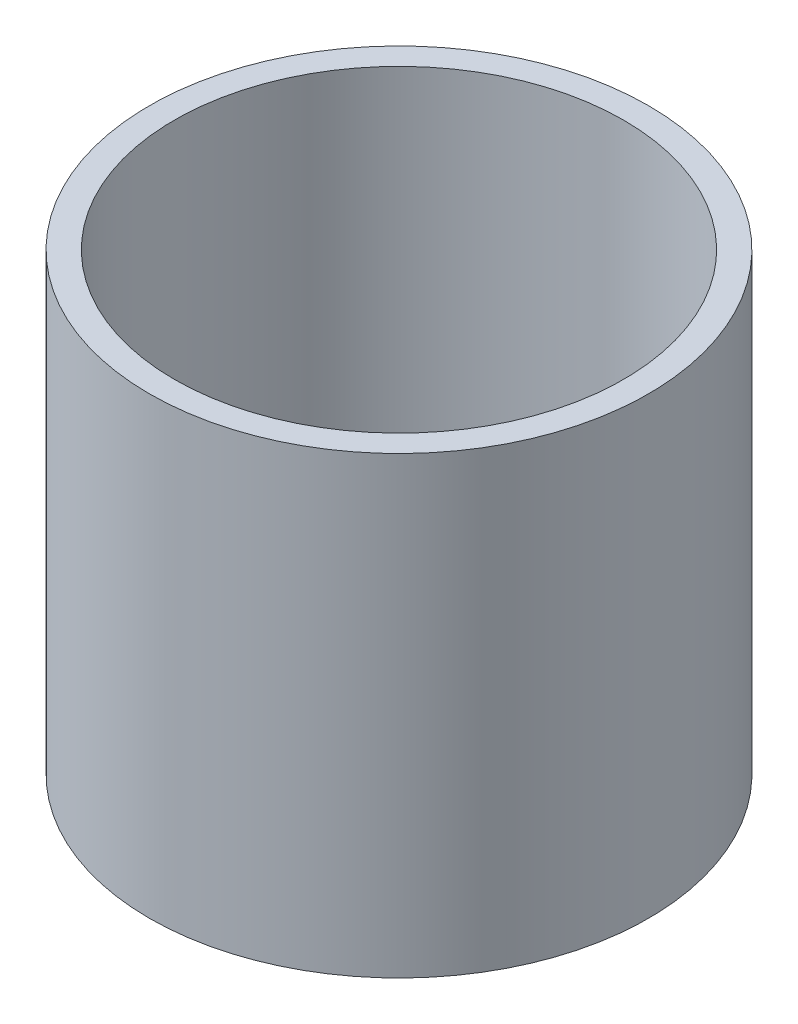
ISO-10303-21;
HEADER;
FILE_DESCRIPTION(('STEP AP214'),'2;1');
FILE_NAME('part.step','',(''),(''),'','','');
FILE_SCHEMA(('AUTOMOTIVE_DESIGN { 1 0 10303 214 1 1 1 1 }'));
ENDSEC;
DATA;
#1=APPLICATION_CONTEXT('core data for automotive mechanical design processes');
#2=APPLICATION_PROTOCOL_DEFINITION('international standard','automotive_design',2000,#1);
#3=PRODUCT_CONTEXT('',#1,'mechanical');
#4=PRODUCT('Part','Part','',(#3));
#5=PRODUCT_RELATED_PRODUCT_CATEGORY('part','',(#4));
#6=PRODUCT_DEFINITION_FORMATION('','',#4);
#7=PRODUCT_DEFINITION_CONTEXT('part definition',#1,'design');
#8=PRODUCT_DEFINITION('design','',#6,#7);
#9=PRODUCT_DEFINITION_SHAPE('','',#8);
#10=(LENGTH_UNIT() NAMED_UNIT(*) SI_UNIT(.MILLI.,.METRE.));
#11=(NAMED_UNIT(*) PLANE_ANGLE_UNIT() SI_UNIT($,.RADIAN.));
#12=(NAMED_UNIT(*) SI_UNIT($,.STERADIAN.) SOLID_ANGLE_UNIT());
#13=UNCERTAINTY_MEASURE_WITH_UNIT(LENGTH_MEASURE(1.E-05),#10,'distance_accuracy_value','');
#14=(GEOMETRIC_REPRESENTATION_CONTEXT(3) GLOBAL_UNCERTAINTY_ASSIGNED_CONTEXT((#13)) GLOBAL_UNIT_ASSIGNED_CONTEXT((#10,
#11,#12)) REPRESENTATION_CONTEXT('',''));
#15=CARTESIAN_POINT('',(0.,0.,0.));
#16=DIRECTION('',(0.,0.,1.));
#17=DIRECTION('',(1.,0.,0.));
#18=AXIS2_PLACEMENT_3D('',#15,#16,#17);
#19=CARTESIAN_POINT('',(0.,13.,0.));
#20=DIRECTION('',(0.,-1.,0.));
#21=DIRECTION('',(0.,0.,-1.));
#22=AXIS2_PLACEMENT_3D('',#19,#20,#21);
#23=CYLINDRICAL_SURFACE('',#22,50.);
#24=CARTESIAN_POINT('',(0.,0.,0.));
#25=DIRECTION('',(0.,1.,0.));
#26=DIRECTION('',(0.,0.,1.));
#27=AXIS2_PLACEMENT_3D('',#24,#25,#26);
#28=CIRCLE('',#27,50.);
#29=CARTESIAN_POINT('',(0.,0.,50.));
#30=VERTEX_POINT('',#29);
#31=EDGE_CURVE('E184',#30,#30,#28,.T.);
#32=ORIENTED_EDGE('',*,*,#31,.T.);
#33=EDGE_LOOP('',(#32));
#34=FACE_BOUND('',#33,.T.);
#35=DIRECTION('',(0.,-1.,0.));
#36=VECTOR('',#35,1.);
#37=CARTESIAN_POINT('',(-20.,13.,-45.8257569495584));
#38=LINE('',#37,#36);
#39=CARTESIAN_POINT('',(-20.,13.,-45.8257569495584));
#40=VERTEX_POINT('',#39);
#41=CARTESIAN_POINT('',(-20.,16.,-45.8257569495584));
#42=VERTEX_POINT('',#41);
#43=EDGE_CURVE('E150',#40,#42,#38,.F.);
#44=ORIENTED_EDGE('',*,*,#43,.F.);
#45=CARTESIAN_POINT('',(0.,13.,0.));
#46=DIRECTION('',(0.,1.,0.));
#47=DIRECTION('',(0.,0.,1.));
#48=AXIS2_PLACEMENT_3D('',#45,#46,#47);
#49=CIRCLE('',#48,50.);
#50=CARTESIAN_POINT('',(-35.0151456159349,13.,-35.6922901688148));
#51=VERTEX_POINT('',#50);
#52=EDGE_CURVE('E111',#40,#51,#49,.T.);
#53=ORIENTED_EDGE('',*,*,#52,.T.);
#54=DIRECTION('',(0.,-1.,0.));
#55=VECTOR('',#54,1.);
#56=CARTESIAN_POINT('',(-35.0151456159349,13.,-35.6922901688148));
#57=LINE('',#56,#55);
#58=CARTESIAN_POINT('',(-35.0151456159349,3.,-35.6922901688148));
#59=VERTEX_POINT('',#58);
#60=EDGE_CURVE('E172',#59,#51,#57,.F.);
#61=ORIENTED_EDGE('',*,*,#60,.F.);
#62=CARTESIAN_POINT('',(0.,3.,0.));
#63=DIRECTION('',(0.,-1.,0.));
#64=DIRECTION('',(0.,0.,-1.));
#65=AXIS2_PLACEMENT_3D('',#62,#63,#64);
#66=CIRCLE('',#65,50.);
#67=CARTESIAN_POINT('',(34.9848543840651,3.,-35.7219815201475));
#68=VERTEX_POINT('',#67);
#69=EDGE_CURVE('E103',#59,#68,#66,.T.);
#70=ORIENTED_EDGE('',*,*,#69,.T.);
#71=DIRECTION('',(0.,-1.,0.));
#72=VECTOR('',#71,1.);
#73=CARTESIAN_POINT('',(34.9848543840651,13.,-35.7219815201475));
#74=LINE('',#73,#72);
#75=CARTESIAN_POINT('',(34.9848543840651,13.,-35.7219815201475));
#76=VERTEX_POINT('',#75);
#77=EDGE_CURVE('E171',#76,#68,#74,.T.);
#78=ORIENTED_EDGE('',*,*,#77,.F.);
#79=CARTESIAN_POINT('',(20.,13.,-45.8257569495584));
#80=VERTEX_POINT('',#79);
#81=EDGE_CURVE('E36',#76,#80,#49,.T.);
#82=ORIENTED_EDGE('',*,*,#81,.T.);
#83=DIRECTION('',(0.,-1.,0.));
#84=VECTOR('',#83,1.);
#85=CARTESIAN_POINT('',(20.,13.,-45.8257569495584));
#86=LINE('',#85,#84);
#87=CARTESIAN_POINT('',(20.,16.,-45.8257569495584));
#88=VERTEX_POINT('',#87);
#89=EDGE_CURVE('E167',#80,#88,#86,.F.);
#90=ORIENTED_EDGE('',*,*,#89,.T.);
#91=CARTESIAN_POINT('',(0.,16.,0.));
#92=DIRECTION('',(0.,1.,0.));
#93=DIRECTION('',(0.,0.,1.));
#94=AXIS2_PLACEMENT_3D('',#91,#92,#93);
#95=CIRCLE('',#94,50.);
#96=EDGE_CURVE('E141',#88,#42,#95,.T.);
#97=ORIENTED_EDGE('',*,*,#96,.T.);
#98=EDGE_LOOP('',(#44,#53,#61,#70,#78,#82,#90,#97));
#99=FACE_BOUND('',#98,.T.);
#100=CARTESIAN_POINT('',(0.,91.,0.));
#101=DIRECTION('',(0.,1.,0.));
#102=DIRECTION('',(0.,0.,1.));
#103=AXIS2_PLACEMENT_3D('',#100,#101,#102);
#104=CIRCLE('',#103,50.);
#105=CARTESIAN_POINT('',(0.,91.,50.));
#106=VERTEX_POINT('',#105);
#107=EDGE_CURVE('E187',#106,#106,#104,.T.);
#108=ORIENTED_EDGE('',*,*,#107,.F.);
#109=EDGE_LOOP('',(#108));
#110=FACE_BOUND('',#109,.T.);
#111=ADVANCED_FACE('F33',(#34,#99,#110),#23,.T.);
#112=CARTESIAN_POINT('',(0.,13.,0.));
#113=DIRECTION('',(0.,1.,0.));
#114=DIRECTION('',(0.,0.,1.));
#115=AXIS2_PLACEMENT_3D('',#112,#113,#114);
#116=PLANE('',#115);
#117=ORIENTED_EDGE('',*,*,#52,.F.);
#118=DIRECTION('',(0.,0.,1.));
#119=VECTOR('',#118,1.);
#120=CARTESIAN_POINT('',(-20.,13.,0.));
#121=LINE('',#120,#119);
#122=CARTESIAN_POINT('',(-20.,13.,19.1742430504416));
#123=VERTEX_POINT('',#122);
#124=EDGE_CURVE('E56',#40,#123,#121,.T.);
#125=ORIENTED_EDGE('',*,*,#124,.T.);
#126=DIRECTION('',(1.,0.,0.));
#127=VECTOR('',#126,1.);
#128=CARTESIAN_POINT('',(0.,13.,19.1742430504416));
#129=LINE('',#128,#127);
#130=CARTESIAN_POINT('',(20.,13.,19.1742430504416));
#131=VERTEX_POINT('',#130);
#132=EDGE_CURVE('E71',#123,#131,#129,.T.);
#133=ORIENTED_EDGE('',*,*,#132,.T.);
#134=DIRECTION('',(0.,0.,-1.));
#135=VECTOR('',#134,1.);
#136=CARTESIAN_POINT('',(20.,13.,0.));
#137=LINE('',#136,#135);
#138=EDGE_CURVE('E163',#131,#80,#137,.T.);
#139=ORIENTED_EDGE('',*,*,#138,.T.);
#140=ORIENTED_EDGE('',*,*,#81,.F.);
#141=DIRECTION('',(0.,0.,1.));
#142=VECTOR('',#141,1.);
#143=CARTESIAN_POINT('',(34.9848543840651,13.,0.));
#144=LINE('',#143,#142);
#145=CARTESIAN_POINT('',(34.9848543840651,13.,19.2021898319126));
#146=VERTEX_POINT('',#145);
#147=EDGE_CURVE('E80',#76,#146,#144,.T.);
#148=ORIENTED_EDGE('',*,*,#147,.T.);
#149=DIRECTION('',(-1.,0.,0.));
#150=VECTOR('',#149,1.);
#151=CARTESIAN_POINT('',(34.9848543840651,13.,19.2021898319126));
#152=LINE('',#151,#150);
#153=CARTESIAN_POINT('',(-35.0151456159349,13.,19.2021898319127));
#154=VERTEX_POINT('',#153);
#155=EDGE_CURVE('E175',#146,#154,#152,.T.);
#156=ORIENTED_EDGE('',*,*,#155,.T.);
#157=DIRECTION('',(0.,0.,-1.));
#158=VECTOR('',#157,1.);
#159=CARTESIAN_POINT('',(-35.0151456159349,13.,19.2021898319127));
#160=LINE('',#159,#158);
#161=EDGE_CURVE('E178',#154,#51,#160,.T.);
#162=ORIENTED_EDGE('',*,*,#161,.T.);
#163=EDGE_LOOP('',(#117,#125,#133,#139,#140,#148,#156,#162));
#164=FACE_BOUND('',#163,.T.);
#165=ADVANCED_FACE('F205',(#164),#116,.F.);
#166=CARTESIAN_POINT('',(0.,0.,0.));
#167=DIRECTION('',(0.,1.,0.));
#168=DIRECTION('',(0.,0.,1.));
#169=AXIS2_PLACEMENT_3D('',#166,#167,#168);
#170=PLANE('',#169);
#171=ORIENTED_EDGE('',*,*,#31,.F.);
#172=EDGE_LOOP('',(#171));
#173=FACE_BOUND('',#172,.T.);
#174=ADVANCED_FACE('F210',(#173),#170,.F.);
#175=CARTESIAN_POINT('',(0.,3.,0.));
#176=DIRECTION('',(0.,-1.,0.));
#177=DIRECTION('',(0.,0.,-1.));
#178=AXIS2_PLACEMENT_3D('',#175,#176,#177);
#179=PLANE('',#178);
#180=DIRECTION('',(0.,0.,1.));
#181=VECTOR('',#180,1.);
#182=CARTESIAN_POINT('',(34.9848543840651,3.,-35.7978101680874));
#183=LINE('',#182,#181);
#184=CARTESIAN_POINT('',(34.9848543840651,3.,19.2021898319126));
#185=VERTEX_POINT('',#184);
#186=EDGE_CURVE('E173',#68,#185,#183,.T.);
#187=ORIENTED_EDGE('',*,*,#186,.F.);
#188=ORIENTED_EDGE('',*,*,#69,.F.);
#189=DIRECTION('',(0.,0.,-1.));
#190=VECTOR('',#189,1.);
#191=CARTESIAN_POINT('',(-35.0151456159349,3.,19.2021898319127));
#192=LINE('',#191,#190);
#193=CARTESIAN_POINT('',(-35.0151456159349,3.,19.2021898319127));
#194=VERTEX_POINT('',#193);
#195=EDGE_CURVE('E98',#194,#59,#192,.T.);
#196=ORIENTED_EDGE('',*,*,#195,.F.);
#197=DIRECTION('',(-1.,0.,0.));
#198=VECTOR('',#197,1.);
#199=CARTESIAN_POINT('',(34.9848543840651,3.,19.2021898319126));
#200=LINE('',#199,#198);
#201=EDGE_CURVE('E159',#185,#194,#200,.T.);
#202=ORIENTED_EDGE('',*,*,#201,.F.);
#203=EDGE_LOOP('',(#187,#188,#196,#202));
#204=FACE_BOUND('',#203,.T.);
#205=ADVANCED_FACE('F230',(#204),#179,.F.);
#206=CARTESIAN_POINT('',(-35.0151456159349,3.,19.2021898319127));
#207=DIRECTION('',(1.,0.,0.));
#208=DIRECTION('',(0.,0.,-1.));
#209=AXIS2_PLACEMENT_3D('',#206,#207,#208);
#210=PLANE('',#209);
#211=ORIENTED_EDGE('',*,*,#60,.T.);
#212=ORIENTED_EDGE('',*,*,#161,.F.);
#213=DIRECTION('',(0.,1.,0.));
#214=VECTOR('',#213,1.);
#215=CARTESIAN_POINT('',(-35.0151456159349,3.,19.2021898319127));
#216=LINE('',#215,#214);
#217=EDGE_CURVE('E157',#194,#154,#216,.T.);
#218=ORIENTED_EDGE('',*,*,#217,.F.);
#219=ORIENTED_EDGE('',*,*,#195,.T.);
#220=EDGE_LOOP('',(#211,#212,#218,#219));
#221=FACE_BOUND('',#220,.T.);
#222=ADVANCED_FACE('F233',(#221),#210,.T.);
#223=CARTESIAN_POINT('',(34.9848543840651,3.,-35.7978101680874));
#224=DIRECTION('',(-1.,0.,0.));
#225=DIRECTION('',(0.,0.,1.));
#226=AXIS2_PLACEMENT_3D('',#223,#224,#225);
#227=PLANE('',#226);
#228=ORIENTED_EDGE('',*,*,#77,.T.);
#229=ORIENTED_EDGE('',*,*,#186,.T.);
#230=DIRECTION('',(0.,1.,0.));
#231=VECTOR('',#230,1.);
#232=CARTESIAN_POINT('',(34.9848543840651,3.,19.2021898319126));
#233=LINE('',#232,#231);
#234=EDGE_CURVE('E169',#185,#146,#233,.T.);
#235=ORIENTED_EDGE('',*,*,#234,.T.);
#236=ORIENTED_EDGE('',*,*,#147,.F.);
#237=EDGE_LOOP('',(#228,#229,#235,#236));
#238=FACE_BOUND('',#237,.T.);
#239=ADVANCED_FACE('F224',(#238),#227,.T.);
#240=CARTESIAN_POINT('',(34.9848543840651,3.,19.2021898319126));
#241=DIRECTION('',(0.,0.,-1.));
#242=DIRECTION('',(-1.,0.,0.));
#243=AXIS2_PLACEMENT_3D('',#240,#241,#242);
#244=PLANE('',#243);
#245=ORIENTED_EDGE('',*,*,#155,.F.);
#246=ORIENTED_EDGE('',*,*,#234,.F.);
#247=ORIENTED_EDGE('',*,*,#201,.T.);
#248=ORIENTED_EDGE('',*,*,#217,.T.);
#249=EDGE_LOOP('',(#245,#246,#247,#248));
#250=FACE_BOUND('',#249,.T.);
#251=ADVANCED_FACE('F217',(#250),#244,.T.);
#252=CARTESIAN_POINT('',(20.,6.,19.1742430504416));
#253=DIRECTION('',(0.,0.,1.));
#254=DIRECTION('',(1.,0.,0.));
#255=AXIS2_PLACEMENT_3D('',#252,#253,#254);
#256=PLANE('',#255);
#257=DIRECTION('',(0.,1.,0.));
#258=VECTOR('',#257,1.);
#259=CARTESIAN_POINT('',(-20.,6.,19.1742430504416));
#260=LINE('',#259,#258);
#261=CARTESIAN_POINT('',(-20.,16.,19.1742430504416));
#262=VERTEX_POINT('',#261);
#263=EDGE_CURVE('E156',#123,#262,#260,.T.);
#264=ORIENTED_EDGE('',*,*,#263,.T.);
#265=DIRECTION('',(1.,0.,0.));
#266=VECTOR('',#265,1.);
#267=CARTESIAN_POINT('',(20.,16.,19.1742430504416));
#268=LINE('',#267,#266);
#269=CARTESIAN_POINT('',(20.,16.,19.1742430504416));
#270=VERTEX_POINT('',#269);
#271=EDGE_CURVE('E155',#262,#270,#268,.T.);
#272=ORIENTED_EDGE('',*,*,#271,.T.);
#273=DIRECTION('',(0.,1.,0.));
#274=VECTOR('',#273,1.);
#275=CARTESIAN_POINT('',(20.,6.,19.1742430504416));
#276=LINE('',#275,#274);
#277=EDGE_CURVE('E146',#131,#270,#276,.T.);
#278=ORIENTED_EDGE('',*,*,#277,.F.);
#279=ORIENTED_EDGE('',*,*,#132,.F.);
#280=EDGE_LOOP('',(#264,#272,#278,#279));
#281=FACE_BOUND('',#280,.T.);
#282=ADVANCED_FACE('F215',(#281),#256,.F.);
#283=CARTESIAN_POINT('',(20.,6.,-45.8257569495584));
#284=DIRECTION('',(1.,0.,0.));
#285=DIRECTION('',(0.,0.,-1.));
#286=AXIS2_PLACEMENT_3D('',#283,#284,#285);
#287=PLANE('',#286);
#288=ORIENTED_EDGE('',*,*,#277,.T.);
#289=DIRECTION('',(0.,0.,-1.));
#290=VECTOR('',#289,1.);
#291=CARTESIAN_POINT('',(20.,16.,-45.8257569495584));
#292=LINE('',#291,#290);
#293=CARTESIAN_POINT('',(20.,16.,-40.3112887414928));
#294=VERTEX_POINT('',#293);
#295=EDGE_CURVE('E132',#270,#294,#292,.T.);
#296=ORIENTED_EDGE('',*,*,#295,.T.);
#297=EDGE_CURVE('E142',#294,#88,#292,.T.);
#298=ORIENTED_EDGE('',*,*,#297,.T.);
#299=ORIENTED_EDGE('',*,*,#89,.F.);
#300=ORIENTED_EDGE('',*,*,#138,.F.);
#301=EDGE_LOOP('',(#288,#296,#298,#299,#300));
#302=FACE_BOUND('',#301,.T.);
#303=ADVANCED_FACE('F148',(#302),#287,.F.);
#304=CARTESIAN_POINT('',(-20.,6.,19.1742430504416));
#305=DIRECTION('',(-1.,0.,0.));
#306=DIRECTION('',(0.,0.,1.));
#307=AXIS2_PLACEMENT_3D('',#304,#305,#306);
#308=PLANE('',#307);
#309=ORIENTED_EDGE('',*,*,#43,.T.);
#310=DIRECTION('',(0.,0.,1.));
#311=VECTOR('',#310,1.);
#312=CARTESIAN_POINT('',(-20.,16.,19.1742430504416));
#313=LINE('',#312,#311);
#314=CARTESIAN_POINT('',(-20.,16.,-40.3112887414928));
#315=VERTEX_POINT('',#314);
#316=EDGE_CURVE('E11',#42,#315,#313,.T.);
#317=ORIENTED_EDGE('',*,*,#316,.T.);
#318=EDGE_CURVE('E41',#315,#262,#313,.T.);
#319=ORIENTED_EDGE('',*,*,#318,.T.);
#320=ORIENTED_EDGE('',*,*,#263,.F.);
#321=ORIENTED_EDGE('',*,*,#124,.F.);
#322=EDGE_LOOP('',(#309,#317,#319,#320,#321));
#323=FACE_BOUND('',#322,.T.);
#324=ADVANCED_FACE('F200',(#323),#308,.F.);
#325=CARTESIAN_POINT('',(0.,91.,0.));
#326=DIRECTION('',(0.,1.,0.));
#327=DIRECTION('',(0.,0.,1.));
#328=AXIS2_PLACEMENT_3D('',#325,#326,#327);
#329=PLANE('',#328);
#330=CARTESIAN_POINT('',(0.,91.,0.));
#331=DIRECTION('',(0.,1.,0.));
#332=DIRECTION('',(0.,0.,1.));
#333=AXIS2_PLACEMENT_3D('',#330,#331,#332);
#334=CIRCLE('',#333,45.);
#335=CARTESIAN_POINT('',(0.,91.,45.));
#336=VERTEX_POINT('',#335);
#337=EDGE_CURVE('E136',#336,#336,#334,.T.);
#338=ORIENTED_EDGE('',*,*,#337,.F.);
#339=EDGE_LOOP('',(#338));
#340=FACE_BOUND('',#339,.T.);
#341=ORIENTED_EDGE('',*,*,#107,.T.);
#342=EDGE_LOOP('',(#341));
#343=FACE_BOUND('',#342,.T.);
#344=ADVANCED_FACE('F197',(#340,#343),#329,.T.);
#345=CARTESIAN_POINT('',(0.,16.,0.));
#346=DIRECTION('',(0.,1.,0.));
#347=DIRECTION('',(0.,0.,1.));
#348=AXIS2_PLACEMENT_3D('',#345,#346,#347);
#349=PLANE('',#348);
#350=ORIENTED_EDGE('',*,*,#297,.F.);
#351=CARTESIAN_POINT('',(0.,16.,0.));
#352=DIRECTION('',(0.,1.,0.));
#353=DIRECTION('',(0.,0.,1.));
#354=AXIS2_PLACEMENT_3D('',#351,#352,#353);
#355=CIRCLE('',#354,45.);
#356=EDGE_CURVE('E135',#294,#315,#355,.T.);
#357=ORIENTED_EDGE('',*,*,#356,.T.);
#358=ORIENTED_EDGE('',*,*,#316,.F.);
#359=ORIENTED_EDGE('',*,*,#96,.F.);
#360=EDGE_LOOP('',(#350,#357,#358,#359));
#361=FACE_BOUND('',#360,.T.);
#362=ADVANCED_FACE('F143',(#361),#349,.F.);
#363=CARTESIAN_POINT('',(0.,16.,0.));
#364=DIRECTION('',(0.,1.,0.));
#365=DIRECTION('',(0.,0.,1.));
#366=AXIS2_PLACEMENT_3D('',#363,#364,#365);
#367=PLANE('',#366);
#368=ORIENTED_EDGE('',*,*,#295,.F.);
#369=ORIENTED_EDGE('',*,*,#271,.F.);
#370=ORIENTED_EDGE('',*,*,#318,.F.);
#371=EDGE_CURVE('E47',#315,#294,#355,.T.);
#372=ORIENTED_EDGE('',*,*,#371,.T.);
#373=EDGE_LOOP('',(#368,#369,#370,#372));
#374=FACE_BOUND('',#373,.T.);
#375=ADVANCED_FACE('F130',(#374),#367,.T.);
#376=CARTESIAN_POINT('',(0.,16.,0.));
#377=DIRECTION('',(0.,1.,0.));
#378=DIRECTION('',(0.,0.,1.));
#379=AXIS2_PLACEMENT_3D('',#376,#377,#378);
#380=CYLINDRICAL_SURFACE('',#379,45.);
#381=ORIENTED_EDGE('',*,*,#356,.F.);
#382=ORIENTED_EDGE('',*,*,#371,.F.);
#383=EDGE_LOOP('',(#381,#382));
#384=FACE_BOUND('',#383,.T.);
#385=ORIENTED_EDGE('',*,*,#337,.T.);
#386=EDGE_LOOP('',(#385));
#387=FACE_BOUND('',#386,.T.);
#388=ADVANCED_FACE('F139',(#384,#387),#380,.F.);
#389=CLOSED_SHELL('',(#111,#165,#174,#205,#222,#239,#251,#282,#303,#324,#344,#362,#375,#388));
#390=MANIFOLD_SOLID_BREP('B2',#389);
#391=ADVANCED_BREP_SHAPE_REPRESENTATION('',(#18,#390),#14);
#392=SHAPE_DEFINITION_REPRESENTATION(#9,#391);
ENDSEC;
END-ISO-10303-21;
